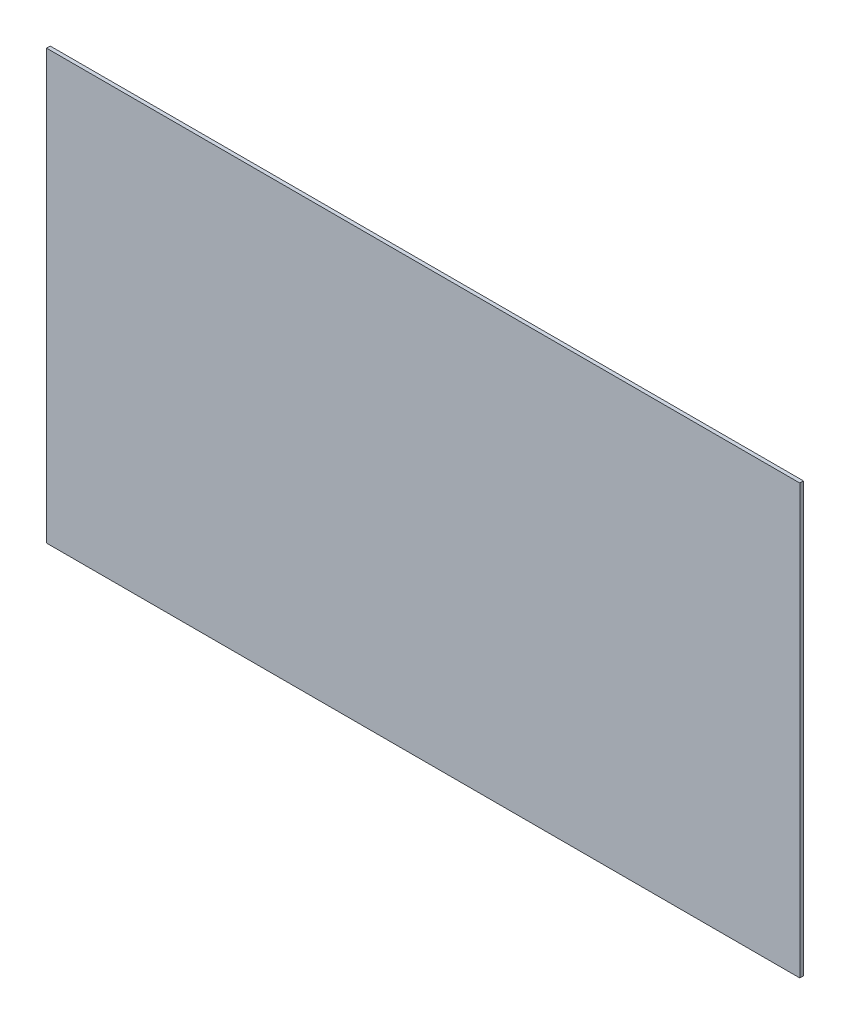
ISO-10303-21;
HEADER;
FILE_DESCRIPTION(('STEP AP214'),'2;1');
FILE_NAME('part.step','',(''),(''),'','','');
FILE_SCHEMA(('AUTOMOTIVE_DESIGN { 1 0 10303 214 1 1 1 1 }'));
ENDSEC;
DATA;
#1=APPLICATION_CONTEXT('core data for automotive mechanical design processes');
#2=APPLICATION_PROTOCOL_DEFINITION('international standard','automotive_design',2000,#1);
#3=PRODUCT_CONTEXT('',#1,'mechanical');
#4=PRODUCT('Part','Part','',(#3));
#5=PRODUCT_RELATED_PRODUCT_CATEGORY('part','',(#4));
#6=PRODUCT_DEFINITION_FORMATION('','',#4);
#7=PRODUCT_DEFINITION_CONTEXT('part definition',#1,'design');
#8=PRODUCT_DEFINITION('design','',#6,#7);
#9=PRODUCT_DEFINITION_SHAPE('','',#8);
#10=(LENGTH_UNIT() NAMED_UNIT(*) SI_UNIT(.MILLI.,.METRE.));
#11=(NAMED_UNIT(*) PLANE_ANGLE_UNIT() SI_UNIT($,.RADIAN.));
#12=(NAMED_UNIT(*) SI_UNIT($,.STERADIAN.) SOLID_ANGLE_UNIT());
#13=UNCERTAINTY_MEASURE_WITH_UNIT(LENGTH_MEASURE(1.E-05),#10,'distance_accuracy_value','');
#14=(GEOMETRIC_REPRESENTATION_CONTEXT(3) GLOBAL_UNCERTAINTY_ASSIGNED_CONTEXT((#13)) GLOBAL_UNIT_ASSIGNED_CONTEXT((#10,
#11,#12)) REPRESENTATION_CONTEXT('',''));
#15=CARTESIAN_POINT('',(0.,0.,0.));
#16=DIRECTION('',(0.,0.,1.));
#17=DIRECTION('',(1.,0.,0.));
#18=AXIS2_PLACEMENT_3D('',#15,#16,#17);
#19=CARTESIAN_POINT('',(0.,0.,3.));
#20=DIRECTION('',(1.,0.,0.));
#21=DIRECTION('',(0.,0.,-1.));
#22=AXIS2_PLACEMENT_3D('',#19,#20,#21);
#23=PLANE('',#22);
#24=DIRECTION('',(0.,-1.,0.));
#25=VECTOR('',#24,1.);
#26=CARTESIAN_POINT('',(0.,0.,0.));
#27=LINE('',#26,#25);
#28=CARTESIAN_POINT('',(0.,350.,0.));
#29=VERTEX_POINT('',#28);
#30=CARTESIAN_POINT('',(0.,0.,0.));
#31=VERTEX_POINT('',#30);
#32=EDGE_CURVE('E98',#29,#31,#27,.T.);
#33=ORIENTED_EDGE('',*,*,#32,.T.);
#34=DIRECTION('',(0.,0.,-1.));
#35=VECTOR('',#34,1.);
#36=CARTESIAN_POINT('',(0.,0.,3.));
#37=LINE('',#36,#35);
#38=CARTESIAN_POINT('',(0.,0.,3.));
#39=VERTEX_POINT('',#38);
#40=EDGE_CURVE('E11',#39,#31,#37,.T.);
#41=ORIENTED_EDGE('',*,*,#40,.F.);
#42=DIRECTION('',(0.,-1.,0.));
#43=VECTOR('',#42,1.);
#44=CARTESIAN_POINT('',(0.,0.,3.));
#45=LINE('',#44,#43);
#46=CARTESIAN_POINT('',(0.,350.,3.));
#47=VERTEX_POINT('',#46);
#48=EDGE_CURVE('E86',#47,#39,#45,.T.);
#49=ORIENTED_EDGE('',*,*,#48,.F.);
#50=DIRECTION('',(0.,0.,-1.));
#51=VECTOR('',#50,1.);
#52=CARTESIAN_POINT('',(0.,350.,3.));
#53=LINE('',#52,#51);
#54=EDGE_CURVE('E94',#47,#29,#53,.T.);
#55=ORIENTED_EDGE('',*,*,#54,.T.);
#56=EDGE_LOOP('',(#33,#41,#49,#55));
#57=FACE_BOUND('',#56,.T.);
#58=ADVANCED_FACE('F35',(#57),#23,.F.);
#59=CARTESIAN_POINT('',(0.,0.,3.));
#60=DIRECTION('',(0.,1.,0.));
#61=DIRECTION('',(0.,0.,1.));
#62=AXIS2_PLACEMENT_3D('',#59,#60,#61);
#63=PLANE('',#62);
#64=DIRECTION('',(1.,0.,0.));
#65=VECTOR('',#64,1.);
#66=CARTESIAN_POINT('',(0.,0.,0.));
#67=LINE('',#66,#65);
#68=CARTESIAN_POINT('',(615.,0.,0.));
#69=VERTEX_POINT('',#68);
#70=EDGE_CURVE('E90',#31,#69,#67,.T.);
#71=ORIENTED_EDGE('',*,*,#70,.T.);
#72=DIRECTION('',(0.,0.,-1.));
#73=VECTOR('',#72,1.);
#74=CARTESIAN_POINT('',(615.,0.,3.));
#75=LINE('',#74,#73);
#76=CARTESIAN_POINT('',(615.,0.,3.));
#77=VERTEX_POINT('',#76);
#78=EDGE_CURVE('E43',#77,#69,#75,.T.);
#79=ORIENTED_EDGE('',*,*,#78,.F.);
#80=DIRECTION('',(1.,0.,0.));
#81=VECTOR('',#80,1.);
#82=CARTESIAN_POINT('',(0.,0.,3.));
#83=LINE('',#82,#81);
#84=EDGE_CURVE('E81',#39,#77,#83,.T.);
#85=ORIENTED_EDGE('',*,*,#84,.F.);
#86=ORIENTED_EDGE('',*,*,#40,.T.);
#87=EDGE_LOOP('',(#71,#79,#85,#86));
#88=FACE_BOUND('',#87,.T.);
#89=ADVANCED_FACE('F89',(#88),#63,.F.);
#90=CARTESIAN_POINT('',(615.,0.,3.));
#91=DIRECTION('',(-1.,0.,0.));
#92=DIRECTION('',(0.,0.,1.));
#93=AXIS2_PLACEMENT_3D('',#90,#91,#92);
#94=PLANE('',#93);
#95=DIRECTION('',(0.,1.,0.));
#96=VECTOR('',#95,1.);
#97=CARTESIAN_POINT('',(615.,0.,0.));
#98=LINE('',#97,#96);
#99=CARTESIAN_POINT('',(615.,350.,0.));
#100=VERTEX_POINT('',#99);
#101=EDGE_CURVE('E68',#69,#100,#98,.T.);
#102=ORIENTED_EDGE('',*,*,#101,.T.);
#103=DIRECTION('',(0.,0.,-1.));
#104=VECTOR('',#103,1.);
#105=CARTESIAN_POINT('',(615.,350.,3.));
#106=LINE('',#105,#104);
#107=CARTESIAN_POINT('',(615.,350.,3.));
#108=VERTEX_POINT('',#107);
#109=EDGE_CURVE('E91',#108,#100,#106,.T.);
#110=ORIENTED_EDGE('',*,*,#109,.F.);
#111=DIRECTION('',(0.,1.,0.));
#112=VECTOR('',#111,1.);
#113=CARTESIAN_POINT('',(615.,0.,3.));
#114=LINE('',#113,#112);
#115=EDGE_CURVE('E84',#77,#108,#114,.T.);
#116=ORIENTED_EDGE('',*,*,#115,.F.);
#117=ORIENTED_EDGE('',*,*,#78,.T.);
#118=EDGE_LOOP('',(#102,#110,#116,#117));
#119=FACE_BOUND('',#118,.T.);
#120=ADVANCED_FACE('F92',(#119),#94,.F.);
#121=CARTESIAN_POINT('',(0.,350.,3.));
#122=DIRECTION('',(0.,-1.,0.));
#123=DIRECTION('',(0.,0.,-1.));
#124=AXIS2_PLACEMENT_3D('',#121,#122,#123);
#125=PLANE('',#124);
#126=DIRECTION('',(-1.,0.,0.));
#127=VECTOR('',#126,1.);
#128=CARTESIAN_POINT('',(0.,350.,0.));
#129=LINE('',#128,#127);
#130=EDGE_CURVE('E74',#100,#29,#129,.T.);
#131=ORIENTED_EDGE('',*,*,#130,.T.);
#132=ORIENTED_EDGE('',*,*,#54,.F.);
#133=DIRECTION('',(-1.,0.,0.));
#134=VECTOR('',#133,1.);
#135=CARTESIAN_POINT('',(0.,350.,3.));
#136=LINE('',#135,#134);
#137=EDGE_CURVE('E51',#108,#47,#136,.T.);
#138=ORIENTED_EDGE('',*,*,#137,.F.);
#139=ORIENTED_EDGE('',*,*,#109,.T.);
#140=EDGE_LOOP('',(#131,#132,#138,#139));
#141=FACE_BOUND('',#140,.T.);
#142=ADVANCED_FACE('F105',(#141),#125,.F.);
#143=CARTESIAN_POINT('',(0.,0.,3.));
#144=DIRECTION('',(0.,0.,-1.));
#145=DIRECTION('',(-1.,0.,0.));
#146=AXIS2_PLACEMENT_3D('',#143,#144,#145);
#147=PLANE('',#146);
#148=ORIENTED_EDGE('',*,*,#48,.T.);
#149=ORIENTED_EDGE('',*,*,#84,.T.);
#150=ORIENTED_EDGE('',*,*,#115,.T.);
#151=ORIENTED_EDGE('',*,*,#137,.T.);
#152=EDGE_LOOP('',(#148,#149,#150,#151));
#153=FACE_BOUND('',#152,.T.);
#154=ADVANCED_FACE('F82',(#153),#147,.F.);
#155=CARTESIAN_POINT('',(0.,0.,0.));
#156=DIRECTION('',(0.,0.,-1.));
#157=DIRECTION('',(-1.,0.,0.));
#158=AXIS2_PLACEMENT_3D('',#155,#156,#157);
#159=PLANE('',#158);
#160=ORIENTED_EDGE('',*,*,#32,.F.);
#161=ORIENTED_EDGE('',*,*,#130,.F.);
#162=ORIENTED_EDGE('',*,*,#101,.F.);
#163=ORIENTED_EDGE('',*,*,#70,.F.);
#164=EDGE_LOOP('',(#160,#161,#162,#163));
#165=FACE_BOUND('',#164,.T.);
#166=ADVANCED_FACE('F108',(#165),#159,.T.);
#167=CLOSED_SHELL('',(#58,#89,#120,#142,#154,#166));
#168=MANIFOLD_SOLID_BREP('B2',#167);
#169=ADVANCED_BREP_SHAPE_REPRESENTATION('',(#18,#168),#14);
#170=SHAPE_DEFINITION_REPRESENTATION(#9,#169);
ENDSEC;
END-ISO-10303-21;
